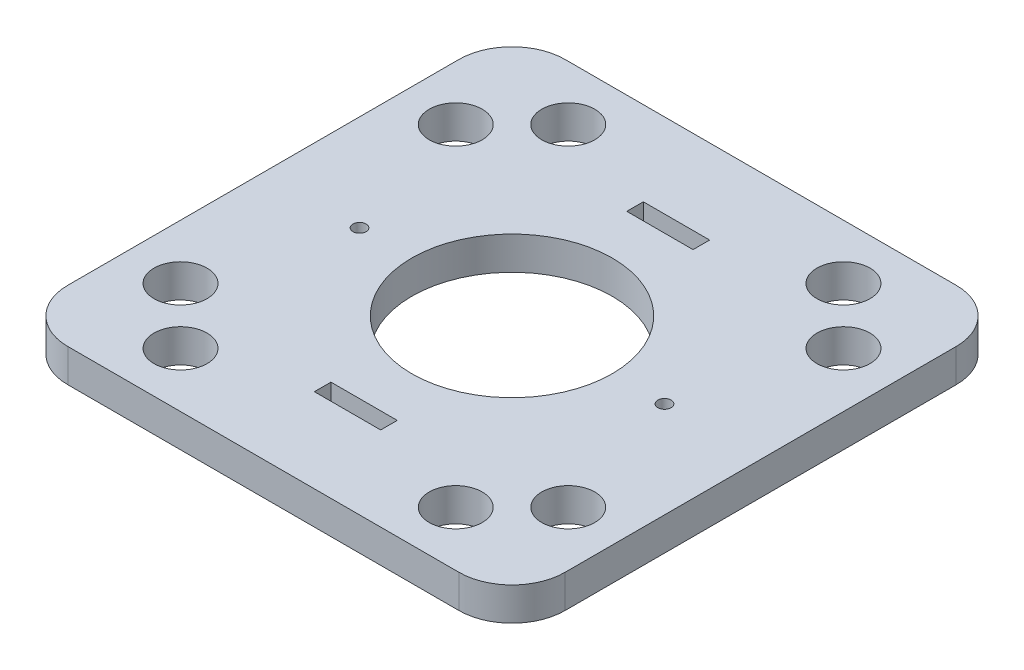
ISO-10303-21;
HEADER;
FILE_DESCRIPTION(('STEP AP214'),'2;1');
FILE_NAME('part.step','',(''),(''),'','','');
FILE_SCHEMA(('AUTOMOTIVE_DESIGN { 1 0 10303 214 1 1 1 1 }'));
ENDSEC;
DATA;
#1=APPLICATION_CONTEXT('core data for automotive mechanical design processes');
#2=APPLICATION_PROTOCOL_DEFINITION('international standard','automotive_design',2000,#1);
#3=PRODUCT_CONTEXT('',#1,'mechanical');
#4=PRODUCT('Part','Part','',(#3));
#5=PRODUCT_RELATED_PRODUCT_CATEGORY('part','',(#4));
#6=PRODUCT_DEFINITION_FORMATION('','',#4);
#7=PRODUCT_DEFINITION_CONTEXT('part definition',#1,'design');
#8=PRODUCT_DEFINITION('design','',#6,#7);
#9=PRODUCT_DEFINITION_SHAPE('','',#8);
#10=(LENGTH_UNIT() NAMED_UNIT(*) SI_UNIT(.MILLI.,.METRE.));
#11=(NAMED_UNIT(*) PLANE_ANGLE_UNIT() SI_UNIT($,.RADIAN.));
#12=(NAMED_UNIT(*) SI_UNIT($,.STERADIAN.) SOLID_ANGLE_UNIT());
#13=UNCERTAINTY_MEASURE_WITH_UNIT(LENGTH_MEASURE(1.E-05),#10,'distance_accuracy_value','');
#14=(GEOMETRIC_REPRESENTATION_CONTEXT(3) GLOBAL_UNCERTAINTY_ASSIGNED_CONTEXT((#13)) GLOBAL_UNIT_ASSIGNED_CONTEXT((#10,
#11,#12)) REPRESENTATION_CONTEXT('',''));
#15=CARTESIAN_POINT('',(0.,0.,0.));
#16=DIRECTION('',(0.,0.,1.));
#17=DIRECTION('',(1.,0.,0.));
#18=AXIS2_PLACEMENT_3D('',#15,#16,#17);
#19=CARTESIAN_POINT('',(0.,5.,0.));
#20=DIRECTION('',(0.,-1.,0.));
#21=DIRECTION('',(0.,0.,-1.));
#22=AXIS2_PLACEMENT_3D('',#19,#20,#21);
#23=PLANE('',#22);
#24=DIRECTION('',(0.,0.,-1.));
#25=VECTOR('',#24,1.);
#26=CARTESIAN_POINT('',(5.,5.,-24.8099608709656));
#27=LINE('',#26,#25);
#28=CARTESIAN_POINT('',(5.,5.,-22.3099608709656));
#29=VERTEX_POINT('',#28);
#30=CARTESIAN_POINT('',(5.,5.,-24.8099608709656));
#31=VERTEX_POINT('',#30);
#32=EDGE_CURVE('E193',#29,#31,#27,.T.);
#33=ORIENTED_EDGE('',*,*,#32,.F.);
#34=DIRECTION('',(1.,0.,0.));
#35=VECTOR('',#34,1.);
#36=CARTESIAN_POINT('',(-5.,5.,-22.3099608709656));
#37=LINE('',#36,#35);
#38=CARTESIAN_POINT('',(-5.,5.,-22.3099608709656));
#39=VERTEX_POINT('',#38);
#40=EDGE_CURVE('E201',#39,#29,#37,.T.);
#41=ORIENTED_EDGE('',*,*,#40,.F.);
#42=DIRECTION('',(0.,0.,1.));
#43=VECTOR('',#42,1.);
#44=CARTESIAN_POINT('',(-5.,5.,-24.8099608709656));
#45=LINE('',#44,#43);
#46=CARTESIAN_POINT('',(-5.,5.,-24.8099608709656));
#47=VERTEX_POINT('',#46);
#48=EDGE_CURVE('E198',#47,#39,#45,.T.);
#49=ORIENTED_EDGE('',*,*,#48,.F.);
#50=DIRECTION('',(-1.,0.,0.));
#51=VECTOR('',#50,1.);
#52=CARTESIAN_POINT('',(-5.,5.,-24.8099608709656));
#53=LINE('',#52,#51);
#54=EDGE_CURVE('E195',#31,#47,#53,.T.);
#55=ORIENTED_EDGE('',*,*,#54,.F.);
#56=EDGE_LOOP('',(#33,#41,#49,#55));
#57=FACE_BOUND('',#56,.T.);
#58=DIRECTION('',(0.,0.,1.));
#59=VECTOR('',#58,1.);
#60=CARTESIAN_POINT('',(-37.5,5.,37.5));
#61=LINE('',#60,#59);
#62=CARTESIAN_POINT('',(-37.5,5.,-29.5));
#63=VERTEX_POINT('',#62);
#64=CARTESIAN_POINT('',(-37.5,5.,29.5));
#65=VERTEX_POINT('',#64);
#66=EDGE_CURVE('E253',#63,#65,#61,.T.);
#67=ORIENTED_EDGE('',*,*,#66,.T.);
#68=CARTESIAN_POINT('',(-29.5,5.,29.5));
#69=DIRECTION('',(0.,-1.,0.));
#70=DIRECTION('',(0.,0.,-1.));
#71=AXIS2_PLACEMENT_3D('',#68,#69,#70);
#72=CIRCLE('',#71,8.);
#73=CARTESIAN_POINT('',(-29.5,5.,37.5));
#74=VERTEX_POINT('',#73);
#75=EDGE_CURVE('E291',#65,#74,#72,.F.);
#76=ORIENTED_EDGE('',*,*,#75,.T.);
#77=DIRECTION('',(1.,0.,0.));
#78=VECTOR('',#77,1.);
#79=CARTESIAN_POINT('',(-37.5,5.,37.5));
#80=LINE('',#79,#78);
#81=CARTESIAN_POINT('',(29.5,5.,37.5));
#82=VERTEX_POINT('',#81);
#83=EDGE_CURVE('E256',#74,#82,#80,.T.);
#84=ORIENTED_EDGE('',*,*,#83,.T.);
#85=CARTESIAN_POINT('',(29.5,5.,29.5));
#86=DIRECTION('',(0.,-1.,0.));
#87=DIRECTION('',(0.,0.,-1.));
#88=AXIS2_PLACEMENT_3D('',#85,#86,#87);
#89=CIRCLE('',#88,8.);
#90=CARTESIAN_POINT('',(37.5,5.,29.5));
#91=VERTEX_POINT('',#90);
#92=EDGE_CURVE('E287',#82,#91,#89,.F.);
#93=ORIENTED_EDGE('',*,*,#92,.T.);
#94=DIRECTION('',(0.,0.,-1.));
#95=VECTOR('',#94,1.);
#96=CARTESIAN_POINT('',(37.5,5.,37.5));
#97=LINE('',#96,#95);
#98=CARTESIAN_POINT('',(37.5,5.,-29.5));
#99=VERTEX_POINT('',#98);
#100=EDGE_CURVE('E248',#91,#99,#97,.T.);
#101=ORIENTED_EDGE('',*,*,#100,.T.);
#102=CARTESIAN_POINT('',(29.5,5.,-29.5));
#103=DIRECTION('',(0.,-1.,0.));
#104=DIRECTION('',(0.,0.,-1.));
#105=AXIS2_PLACEMENT_3D('',#102,#103,#104);
#106=CIRCLE('',#105,8.);
#107=CARTESIAN_POINT('',(29.5,5.,-37.5));
#108=VERTEX_POINT('',#107);
#109=EDGE_CURVE('E55',#99,#108,#106,.F.);
#110=ORIENTED_EDGE('',*,*,#109,.T.);
#111=DIRECTION('',(-1.,0.,0.));
#112=VECTOR('',#111,1.);
#113=CARTESIAN_POINT('',(-37.5,5.,-37.5));
#114=LINE('',#113,#112);
#115=CARTESIAN_POINT('',(-29.5,5.,-37.5));
#116=VERTEX_POINT('',#115);
#117=EDGE_CURVE('E250',#108,#116,#114,.T.);
#118=ORIENTED_EDGE('',*,*,#117,.T.);
#119=CARTESIAN_POINT('',(-29.5,5.,-29.5));
#120=DIRECTION('',(0.,-1.,0.));
#121=DIRECTION('',(0.,0.,-1.));
#122=AXIS2_PLACEMENT_3D('',#119,#120,#121);
#123=CIRCLE('',#122,8.);
#124=EDGE_CURVE('E289',#116,#63,#123,.F.);
#125=ORIENTED_EDGE('',*,*,#124,.T.);
#126=EDGE_LOOP('',(#67,#76,#84,#93,#101,#110,#118,#125));
#127=FACE_BOUND('',#126,.T.);
#128=CARTESIAN_POINT('',(0.,5.,0.));
#129=DIRECTION('',(0.,1.,0.));
#130=DIRECTION('',(0.,0.,1.));
#131=AXIS2_PLACEMENT_3D('',#128,#129,#130);
#132=CIRCLE('',#131,15.1197225230173);
#133=CARTESIAN_POINT('',(0.,5.,15.1197225230173));
#134=VERTEX_POINT('',#133);
#135=EDGE_CURVE('E242',#134,#134,#132,.T.);
#136=ORIENTED_EDGE('',*,*,#135,.F.);
#137=EDGE_LOOP('',(#136));
#138=FACE_BOUND('',#137,.T.);
#139=CARTESIAN_POINT('',(29.2426406871193,5.,-20.7573593128807));
#140=DIRECTION('',(0.,1.,0.));
#141=DIRECTION('',(0.,0.,1.));
#142=AXIS2_PLACEMENT_3D('',#139,#140,#141);
#143=CIRCLE('',#142,4.);
#144=CARTESIAN_POINT('',(29.2426406871193,5.,-16.7573593128807));
#145=VERTEX_POINT('',#144);
#146=EDGE_CURVE('E236',#145,#145,#143,.T.);
#147=ORIENTED_EDGE('',*,*,#146,.F.);
#148=EDGE_LOOP('',(#147));
#149=FACE_BOUND('',#148,.T.);
#150=CARTESIAN_POINT('',(-23.,5.,0.));
#151=DIRECTION('',(0.,1.,0.));
#152=DIRECTION('',(0.,0.,1.));
#153=AXIS2_PLACEMENT_3D('',#150,#151,#152);
#154=CIRCLE('',#153,1.);
#155=CARTESIAN_POINT('',(-23.,5.,1.));
#156=VERTEX_POINT('',#155);
#157=EDGE_CURVE('E230',#156,#156,#154,.T.);
#158=ORIENTED_EDGE('',*,*,#157,.F.);
#159=EDGE_LOOP('',(#158));
#160=FACE_BOUND('',#159,.T.);
#161=CARTESIAN_POINT('',(23.,5.,0.));
#162=DIRECTION('',(0.,1.,0.));
#163=DIRECTION('',(0.,0.,-1.));
#164=AXIS2_PLACEMENT_3D('',#161,#162,#163);
#165=CIRCLE('',#164,1.);
#166=CARTESIAN_POINT('',(23.,5.,-1.));
#167=VERTEX_POINT('',#166);
#168=EDGE_CURVE('E224',#167,#167,#165,.T.);
#169=ORIENTED_EDGE('',*,*,#168,.F.);
#170=EDGE_LOOP('',(#169));
#171=FACE_BOUND('',#170,.T.);
#172=DIRECTION('',(1.,0.,0.));
#173=VECTOR('',#172,1.);
#174=CARTESIAN_POINT('',(-5.00000000000001,5.,24.8099608709656));
#175=LINE('',#174,#173);
#176=CARTESIAN_POINT('',(-5.00000000000001,5.,24.8099608709656));
#177=VERTEX_POINT('',#176);
#178=CARTESIAN_POINT('',(4.99999999999999,5.,24.8099608709656));
#179=VERTEX_POINT('',#178);
#180=EDGE_CURVE('E149',#177,#179,#175,.T.);
#181=ORIENTED_EDGE('',*,*,#180,.F.);
#182=DIRECTION('',(0.,0.,1.));
#183=VECTOR('',#182,1.);
#184=CARTESIAN_POINT('',(-5.00000000000001,5.,24.8099608709656));
#185=LINE('',#184,#183);
#186=CARTESIAN_POINT('',(-5.00000000000001,5.,22.3099608709656));
#187=VERTEX_POINT('',#186);
#188=EDGE_CURVE('E175',#187,#177,#185,.T.);
#189=ORIENTED_EDGE('',*,*,#188,.F.);
#190=DIRECTION('',(-1.,0.,0.));
#191=VECTOR('',#190,1.);
#192=CARTESIAN_POINT('',(-5.00000000000001,5.,22.3099608709656));
#193=LINE('',#192,#191);
#194=CARTESIAN_POINT('',(4.99999999999999,5.,22.3099608709656));
#195=VERTEX_POINT('',#194);
#196=EDGE_CURVE('E173',#195,#187,#193,.T.);
#197=ORIENTED_EDGE('',*,*,#196,.F.);
#198=DIRECTION('',(0.,0.,-1.));
#199=VECTOR('',#198,1.);
#200=CARTESIAN_POINT('',(4.99999999999999,5.,24.8099608709656));
#201=LINE('',#200,#199);
#202=EDGE_CURVE('E159',#179,#195,#201,.T.);
#203=ORIENTED_EDGE('',*,*,#202,.F.);
#204=EDGE_LOOP('',(#181,#189,#197,#203));
#205=FACE_BOUND('',#204,.T.);
#206=CARTESIAN_POINT('',(20.7573593128807,5.,-29.2426406871193));
#207=DIRECTION('',(0.,1.,0.));
#208=DIRECTION('',(0.,0.,-1.));
#209=AXIS2_PLACEMENT_3D('',#206,#207,#208);
#210=CIRCLE('',#209,4.00000000000003);
#211=CARTESIAN_POINT('',(20.7573593128807,5.,-33.2426406871193));
#212=VERTEX_POINT('',#211);
#213=EDGE_CURVE('E182',#212,#212,#210,.T.);
#214=ORIENTED_EDGE('',*,*,#213,.F.);
#215=EDGE_LOOP('',(#214));
#216=FACE_BOUND('',#215,.T.);
#217=CARTESIAN_POINT('',(-20.7573593128807,5.,29.2426406871193));
#218=DIRECTION('',(0.,1.,0.));
#219=DIRECTION('',(0.,0.,-1.));
#220=AXIS2_PLACEMENT_3D('',#217,#218,#219);
#221=CIRCLE('',#220,4.);
#222=CARTESIAN_POINT('',(-20.7573593128807,5.,25.2426406871193));
#223=VERTEX_POINT('',#222);
#224=EDGE_CURVE('E492',#223,#223,#221,.T.);
#225=ORIENTED_EDGE('',*,*,#224,.F.);
#226=EDGE_LOOP('',(#225));
#227=FACE_BOUND('',#226,.T.);
#228=CARTESIAN_POINT('',(-29.2426406871193,5.,20.7573593128807));
#229=DIRECTION('',(0.,1.,0.));
#230=DIRECTION('',(0.,0.,1.));
#231=AXIS2_PLACEMENT_3D('',#228,#229,#230);
#232=CIRCLE('',#231,4.00000000000003);
#233=CARTESIAN_POINT('',(-29.2426406871193,5.,24.7573593128807));
#234=VERTEX_POINT('',#233);
#235=EDGE_CURVE('E487',#234,#234,#232,.T.);
#236=ORIENTED_EDGE('',*,*,#235,.F.);
#237=EDGE_LOOP('',(#236));
#238=FACE_BOUND('',#237,.T.);
#239=CARTESIAN_POINT('',(-20.7573593128807,5.,-29.2426406871193));
#240=DIRECTION('',(0.,1.,0.));
#241=DIRECTION('',(0.,0.,1.));
#242=AXIS2_PLACEMENT_3D('',#239,#240,#241);
#243=CIRCLE('',#242,3.99999999999999);
#244=CARTESIAN_POINT('',(-20.7573593128807,5.,-25.2426406871193));
#245=VERTEX_POINT('',#244);
#246=EDGE_CURVE('E482',#245,#245,#243,.T.);
#247=ORIENTED_EDGE('',*,*,#246,.F.);
#248=EDGE_LOOP('',(#247));
#249=FACE_BOUND('',#248,.T.);
#250=CARTESIAN_POINT('',(-29.2426406871193,5.,-20.7573593128807));
#251=DIRECTION('',(0.,1.,0.));
#252=DIRECTION('',(0.,0.,-1.));
#253=AXIS2_PLACEMENT_3D('',#250,#251,#252);
#254=CIRCLE('',#253,4.00000000000003);
#255=CARTESIAN_POINT('',(-29.2426406871193,5.,-24.7573593128807));
#256=VERTEX_POINT('',#255);
#257=EDGE_CURVE('E477',#256,#256,#254,.T.);
#258=ORIENTED_EDGE('',*,*,#257,.F.);
#259=EDGE_LOOP('',(#258));
#260=FACE_BOUND('',#259,.T.);
#261=CARTESIAN_POINT('',(29.2426406871193,5.,20.7573593128807));
#262=DIRECTION('',(0.,1.,0.));
#263=DIRECTION('',(0.,0.,-1.));
#264=AXIS2_PLACEMENT_3D('',#261,#262,#263);
#265=CIRCLE('',#264,4.);
#266=CARTESIAN_POINT('',(29.2426406871193,5.,16.7573593128807));
#267=VERTEX_POINT('',#266);
#268=EDGE_CURVE('E472',#267,#267,#265,.T.);
#269=ORIENTED_EDGE('',*,*,#268,.F.);
#270=EDGE_LOOP('',(#269));
#271=FACE_BOUND('',#270,.T.);
#272=CARTESIAN_POINT('',(20.7573593128807,5.,29.2426406871193));
#273=DIRECTION('',(0.,1.,0.));
#274=DIRECTION('',(0.,0.,1.));
#275=AXIS2_PLACEMENT_3D('',#272,#273,#274);
#276=CIRCLE('',#275,4.00000000000003);
#277=CARTESIAN_POINT('',(20.7573593128807,5.,33.2426406871193));
#278=VERTEX_POINT('',#277);
#279=EDGE_CURVE('E467',#278,#278,#276,.T.);
#280=ORIENTED_EDGE('',*,*,#279,.F.);
#281=EDGE_LOOP('',(#280));
#282=FACE_BOUND('',#281,.T.);
#283=ADVANCED_FACE('F33',(#57,#127,#138,#149,#160,#171,#205,#216,#227,#238,#249,#260,#271,#282),
#23,.F.);
#284=CARTESIAN_POINT('',(0.,0.,0.));
#285=DIRECTION('',(0.,-1.,0.));
#286=DIRECTION('',(0.,0.,-1.));
#287=AXIS2_PLACEMENT_3D('',#284,#285,#286);
#288=PLANE('',#287);
#289=CARTESIAN_POINT('',(29.2426406871193,0.,20.7573593128807));
#290=DIRECTION('',(0.,1.,0.));
#291=DIRECTION('',(0.,0.,-1.));
#292=AXIS2_PLACEMENT_3D('',#289,#290,#291);
#293=CIRCLE('',#292,4.);
#294=CARTESIAN_POINT('',(29.2426406871193,0.,16.7573593128807));
#295=VERTEX_POINT('',#294);
#296=EDGE_CURVE('E469',#295,#295,#293,.T.);
#297=ORIENTED_EDGE('',*,*,#296,.T.);
#298=EDGE_LOOP('',(#297));
#299=FACE_BOUND('',#298,.T.);
#300=CARTESIAN_POINT('',(-20.7573593128807,0.,-29.2426406871193));
#301=DIRECTION('',(0.,1.,0.));
#302=DIRECTION('',(0.,0.,1.));
#303=AXIS2_PLACEMENT_3D('',#300,#301,#302);
#304=CIRCLE('',#303,3.99999999999999);
#305=CARTESIAN_POINT('',(-20.7573593128807,0.,-25.2426406871193));
#306=VERTEX_POINT('',#305);
#307=EDGE_CURVE('E480',#306,#306,#304,.T.);
#308=ORIENTED_EDGE('',*,*,#307,.T.);
#309=EDGE_LOOP('',(#308));
#310=FACE_BOUND('',#309,.T.);
#311=CARTESIAN_POINT('',(-20.7573593128807,0.,29.2426406871193));
#312=DIRECTION('',(0.,1.,0.));
#313=DIRECTION('',(0.,0.,-1.));
#314=AXIS2_PLACEMENT_3D('',#311,#312,#313);
#315=CIRCLE('',#314,4.);
#316=CARTESIAN_POINT('',(-20.7573593128807,0.,25.2426406871193));
#317=VERTEX_POINT('',#316);
#318=EDGE_CURVE('E490',#317,#317,#315,.T.);
#319=ORIENTED_EDGE('',*,*,#318,.T.);
#320=EDGE_LOOP('',(#319));
#321=FACE_BOUND('',#320,.T.);
#322=DIRECTION('',(0.,0.,1.));
#323=VECTOR('',#322,1.);
#324=CARTESIAN_POINT('',(-5.00000000000001,0.,24.8099608709656));
#325=LINE('',#324,#323);
#326=CARTESIAN_POINT('',(-5.00000000000001,0.,22.3099608709656));
#327=VERTEX_POINT('',#326);
#328=CARTESIAN_POINT('',(-5.00000000000001,0.,24.8099608709656));
#329=VERTEX_POINT('',#328);
#330=EDGE_CURVE('E160',#327,#329,#325,.T.);
#331=ORIENTED_EDGE('',*,*,#330,.T.);
#332=DIRECTION('',(1.,0.,0.));
#333=VECTOR('',#332,1.);
#334=CARTESIAN_POINT('',(-5.00000000000001,0.,24.8099608709656));
#335=LINE('',#334,#333);
#336=CARTESIAN_POINT('',(4.99999999999999,0.,24.8099608709656));
#337=VERTEX_POINT('',#336);
#338=EDGE_CURVE('E180',#329,#337,#335,.T.);
#339=ORIENTED_EDGE('',*,*,#338,.T.);
#340=DIRECTION('',(0.,0.,-1.));
#341=VECTOR('',#340,1.);
#342=CARTESIAN_POINT('',(4.99999999999999,0.,24.8099608709656));
#343=LINE('',#342,#341);
#344=CARTESIAN_POINT('',(4.99999999999999,0.,22.3099608709656));
#345=VERTEX_POINT('',#344);
#346=EDGE_CURVE('E166',#337,#345,#343,.T.);
#347=ORIENTED_EDGE('',*,*,#346,.T.);
#348=DIRECTION('',(-1.,0.,0.));
#349=VECTOR('',#348,1.);
#350=CARTESIAN_POINT('',(-5.00000000000001,0.,22.3099608709656));
#351=LINE('',#350,#349);
#352=EDGE_CURVE('E184',#345,#327,#351,.T.);
#353=ORIENTED_EDGE('',*,*,#352,.T.);
#354=EDGE_LOOP('',(#331,#339,#347,#353));
#355=FACE_BOUND('',#354,.T.);
#356=DIRECTION('',(1.,0.,0.));
#357=VECTOR('',#356,1.);
#358=CARTESIAN_POINT('',(-5.,0.,-22.3099608709656));
#359=LINE('',#358,#357);
#360=CARTESIAN_POINT('',(-5.,0.,-22.3099608709656));
#361=VERTEX_POINT('',#360);
#362=CARTESIAN_POINT('',(5.,0.,-22.3099608709656));
#363=VERTEX_POINT('',#362);
#364=EDGE_CURVE('E196',#361,#363,#359,.T.);
#365=ORIENTED_EDGE('',*,*,#364,.T.);
#366=DIRECTION('',(0.,0.,-1.));
#367=VECTOR('',#366,1.);
#368=CARTESIAN_POINT('',(5.,0.,-24.8099608709656));
#369=LINE('',#368,#367);
#370=CARTESIAN_POINT('',(5.,0.,-24.8099608709656));
#371=VERTEX_POINT('',#370);
#372=EDGE_CURVE('E167',#363,#371,#369,.T.);
#373=ORIENTED_EDGE('',*,*,#372,.T.);
#374=DIRECTION('',(-1.,0.,0.));
#375=VECTOR('',#374,1.);
#376=CARTESIAN_POINT('',(-5.,0.,-24.8099608709656));
#377=LINE('',#376,#375);
#378=CARTESIAN_POINT('',(-5.,0.,-24.8099608709656));
#379=VERTEX_POINT('',#378);
#380=EDGE_CURVE('E206',#371,#379,#377,.T.);
#381=ORIENTED_EDGE('',*,*,#380,.T.);
#382=DIRECTION('',(0.,0.,1.));
#383=VECTOR('',#382,1.);
#384=CARTESIAN_POINT('',(-5.,0.,-24.8099608709656));
#385=LINE('',#384,#383);
#386=EDGE_CURVE('E209',#379,#361,#385,.T.);
#387=ORIENTED_EDGE('',*,*,#386,.T.);
#388=EDGE_LOOP('',(#365,#373,#381,#387));
#389=FACE_BOUND('',#388,.T.);
#390=CARTESIAN_POINT('',(23.,0.,0.));
#391=DIRECTION('',(0.,1.,0.));
#392=DIRECTION('',(0.,0.,-1.));
#393=AXIS2_PLACEMENT_3D('',#390,#391,#392);
#394=CIRCLE('',#393,1.);
#395=CARTESIAN_POINT('',(23.,0.,-1.));
#396=VERTEX_POINT('',#395);
#397=EDGE_CURVE('E223',#396,#396,#394,.T.);
#398=ORIENTED_EDGE('',*,*,#397,.T.);
#399=EDGE_LOOP('',(#398));
#400=FACE_BOUND('',#399,.T.);
#401=CARTESIAN_POINT('',(29.2426406871193,0.,-20.7573593128807));
#402=DIRECTION('',(0.,1.,0.));
#403=DIRECTION('',(0.,0.,1.));
#404=AXIS2_PLACEMENT_3D('',#401,#402,#403);
#405=CIRCLE('',#404,4.);
#406=CARTESIAN_POINT('',(29.2426406871193,0.,-16.7573593128807));
#407=VERTEX_POINT('',#406);
#408=EDGE_CURVE('E233',#407,#407,#405,.T.);
#409=ORIENTED_EDGE('',*,*,#408,.T.);
#410=EDGE_LOOP('',(#409));
#411=FACE_BOUND('',#410,.T.);
#412=DIRECTION('',(1.,0.,0.));
#413=VECTOR('',#412,1.);
#414=CARTESIAN_POINT('',(-37.5,0.,37.5));
#415=LINE('',#414,#413);
#416=CARTESIAN_POINT('',(-29.5,0.,37.5));
#417=VERTEX_POINT('',#416);
#418=CARTESIAN_POINT('',(29.5,0.,37.5));
#419=VERTEX_POINT('',#418);
#420=EDGE_CURVE('E251',#417,#419,#415,.T.);
#421=ORIENTED_EDGE('',*,*,#420,.F.);
#422=CARTESIAN_POINT('',(-29.5,0.,29.5));
#423=DIRECTION('',(0.,-1.,0.));
#424=DIRECTION('',(0.,0.,-1.));
#425=AXIS2_PLACEMENT_3D('',#422,#423,#424);
#426=CIRCLE('',#425,8.);
#427=CARTESIAN_POINT('',(-37.5,0.,29.5));
#428=VERTEX_POINT('',#427);
#429=EDGE_CURVE('E279',#417,#428,#426,.T.);
#430=ORIENTED_EDGE('',*,*,#429,.T.);
#431=DIRECTION('',(0.,0.,1.));
#432=VECTOR('',#431,1.);
#433=CARTESIAN_POINT('',(-37.5,0.,37.5));
#434=LINE('',#433,#432);
#435=CARTESIAN_POINT('',(-37.5,0.,-29.5));
#436=VERTEX_POINT('',#435);
#437=EDGE_CURVE('E264',#436,#428,#434,.T.);
#438=ORIENTED_EDGE('',*,*,#437,.F.);
#439=CARTESIAN_POINT('',(-29.5,0.,-29.5));
#440=DIRECTION('',(0.,-1.,0.));
#441=DIRECTION('',(0.,0.,-1.));
#442=AXIS2_PLACEMENT_3D('',#439,#440,#441);
#443=CIRCLE('',#442,8.);
#444=CARTESIAN_POINT('',(-29.5,0.,-37.5));
#445=VERTEX_POINT('',#444);
#446=EDGE_CURVE('E277',#436,#445,#443,.T.);
#447=ORIENTED_EDGE('',*,*,#446,.T.);
#448=DIRECTION('',(-1.,0.,0.));
#449=VECTOR('',#448,1.);
#450=CARTESIAN_POINT('',(-37.5,0.,-37.5));
#451=LINE('',#450,#449);
#452=CARTESIAN_POINT('',(29.5,0.,-37.5));
#453=VERTEX_POINT('',#452);
#454=EDGE_CURVE('E262',#453,#445,#451,.T.);
#455=ORIENTED_EDGE('',*,*,#454,.F.);
#456=CARTESIAN_POINT('',(29.5,0.,-29.5));
#457=DIRECTION('',(0.,-1.,0.));
#458=DIRECTION('',(0.,0.,-1.));
#459=AXIS2_PLACEMENT_3D('',#456,#457,#458);
#460=CIRCLE('',#459,8.);
#461=CARTESIAN_POINT('',(37.5,0.,-29.5));
#462=VERTEX_POINT('',#461);
#463=EDGE_CURVE('E273',#453,#462,#460,.T.);
#464=ORIENTED_EDGE('',*,*,#463,.T.);
#465=DIRECTION('',(0.,0.,-1.));
#466=VECTOR('',#465,1.);
#467=CARTESIAN_POINT('',(37.5,0.,37.5));
#468=LINE('',#467,#466);
#469=CARTESIAN_POINT('',(37.5,0.,29.5));
#470=VERTEX_POINT('',#469);
#471=EDGE_CURVE('E245',#470,#462,#468,.T.);
#472=ORIENTED_EDGE('',*,*,#471,.F.);
#473=CARTESIAN_POINT('',(29.5,0.,29.5));
#474=DIRECTION('',(0.,-1.,0.));
#475=DIRECTION('',(0.,0.,-1.));
#476=AXIS2_PLACEMENT_3D('',#473,#474,#475);
#477=CIRCLE('',#476,8.);
#478=EDGE_CURVE('E275',#470,#419,#477,.T.);
#479=ORIENTED_EDGE('',*,*,#478,.T.);
#480=EDGE_LOOP('',(#421,#430,#438,#447,#455,#464,#472,#479));
#481=FACE_BOUND('',#480,.T.);
#482=CARTESIAN_POINT('',(0.,0.,0.));
#483=DIRECTION('',(0.,1.,0.));
#484=DIRECTION('',(0.,0.,1.));
#485=AXIS2_PLACEMENT_3D('',#482,#483,#484);
#486=CIRCLE('',#485,15.1197225230173);
#487=CARTESIAN_POINT('',(0.,0.,15.1197225230173));
#488=VERTEX_POINT('',#487);
#489=EDGE_CURVE('E239',#488,#488,#486,.T.);
#490=ORIENTED_EDGE('',*,*,#489,.T.);
#491=EDGE_LOOP('',(#490));
#492=FACE_BOUND('',#491,.T.);
#493=CARTESIAN_POINT('',(-23.,0.,0.));
#494=DIRECTION('',(0.,1.,0.));
#495=DIRECTION('',(0.,0.,1.));
#496=AXIS2_PLACEMENT_3D('',#493,#494,#495);
#497=CIRCLE('',#496,1.);
#498=CARTESIAN_POINT('',(-23.,0.,1.));
#499=VERTEX_POINT('',#498);
#500=EDGE_CURVE('E227',#499,#499,#497,.T.);
#501=ORIENTED_EDGE('',*,*,#500,.T.);
#502=EDGE_LOOP('',(#501));
#503=FACE_BOUND('',#502,.T.);
#504=CARTESIAN_POINT('',(20.7573593128807,0.,-29.2426406871193));
#505=DIRECTION('',(0.,1.,0.));
#506=DIRECTION('',(0.,0.,-1.));
#507=AXIS2_PLACEMENT_3D('',#504,#505,#506);
#508=CIRCLE('',#507,4.00000000000003);
#509=CARTESIAN_POINT('',(20.7573593128807,0.,-33.2426406871193));
#510=VERTEX_POINT('',#509);
#511=EDGE_CURVE('E455',#510,#510,#508,.T.);
#512=ORIENTED_EDGE('',*,*,#511,.T.);
#513=EDGE_LOOP('',(#512));
#514=FACE_BOUND('',#513,.T.);
#515=CARTESIAN_POINT('',(-29.2426406871193,0.,20.7573593128807));
#516=DIRECTION('',(0.,1.,0.));
#517=DIRECTION('',(0.,0.,1.));
#518=AXIS2_PLACEMENT_3D('',#515,#516,#517);
#519=CIRCLE('',#518,4.00000000000003);
#520=CARTESIAN_POINT('',(-29.2426406871193,0.,24.7573593128807));
#521=VERTEX_POINT('',#520);
#522=EDGE_CURVE('E459',#521,#521,#519,.T.);
#523=ORIENTED_EDGE('',*,*,#522,.T.);
#524=EDGE_LOOP('',(#523));
#525=FACE_BOUND('',#524,.T.);
#526=CARTESIAN_POINT('',(-29.2426406871193,0.,-20.7573593128807));
#527=DIRECTION('',(0.,1.,0.));
#528=DIRECTION('',(0.,0.,-1.));
#529=AXIS2_PLACEMENT_3D('',#526,#527,#528);
#530=CIRCLE('',#529,4.00000000000003);
#531=CARTESIAN_POINT('',(-29.2426406871193,0.,-24.7573593128807));
#532=VERTEX_POINT('',#531);
#533=EDGE_CURVE('E463',#532,#532,#530,.T.);
#534=ORIENTED_EDGE('',*,*,#533,.T.);
#535=EDGE_LOOP('',(#534));
#536=FACE_BOUND('',#535,.T.);
#537=CARTESIAN_POINT('',(20.7573593128807,0.,29.2426406871193));
#538=DIRECTION('',(0.,1.,0.));
#539=DIRECTION('',(0.,0.,1.));
#540=AXIS2_PLACEMENT_3D('',#537,#538,#539);
#541=CIRCLE('',#540,4.00000000000003);
#542=CARTESIAN_POINT('',(20.7573593128807,0.,33.2426406871193));
#543=VERTEX_POINT('',#542);
#544=EDGE_CURVE('E466',#543,#543,#541,.T.);
#545=ORIENTED_EDGE('',*,*,#544,.T.);
#546=EDGE_LOOP('',(#545));
#547=FACE_BOUND('',#546,.T.);
#548=ADVANCED_FACE('F310',(#299,#310,#321,#355,#389,#400,#411,#481,#492,#503,#514,#525,#536,
#547),#288,.T.);
#549=CARTESIAN_POINT('',(37.5,5.,37.5));
#550=DIRECTION('',(-1.,0.,0.));
#551=DIRECTION('',(0.,0.,1.));
#552=AXIS2_PLACEMENT_3D('',#549,#550,#551);
#553=PLANE('',#552);
#554=ORIENTED_EDGE('',*,*,#100,.F.);
#555=DIRECTION('',(0.,-1.,0.));
#556=VECTOR('',#555,1.);
#557=CARTESIAN_POINT('',(37.5,5.,29.5));
#558=LINE('',#557,#556);
#559=EDGE_CURVE('E11',#91,#470,#558,.T.);
#560=ORIENTED_EDGE('',*,*,#559,.T.);
#561=ORIENTED_EDGE('',*,*,#471,.T.);
#562=DIRECTION('',(0.,-1.,0.));
#563=VECTOR('',#562,1.);
#564=CARTESIAN_POINT('',(37.5,5.,-29.5));
#565=LINE('',#564,#563);
#566=EDGE_CURVE('E41',#462,#99,#565,.F.);
#567=ORIENTED_EDGE('',*,*,#566,.T.);
#568=EDGE_LOOP('',(#554,#560,#561,#567));
#569=FACE_BOUND('',#568,.T.);
#570=ADVANCED_FACE('F299',(#569),#553,.F.);
#571=CARTESIAN_POINT('',(-37.5,5.,-37.5));
#572=DIRECTION('',(0.,0.,1.));
#573=DIRECTION('',(1.,0.,0.));
#574=AXIS2_PLACEMENT_3D('',#571,#572,#573);
#575=PLANE('',#574);
#576=ORIENTED_EDGE('',*,*,#454,.T.);
#577=DIRECTION('',(0.,-1.,0.));
#578=VECTOR('',#577,1.);
#579=CARTESIAN_POINT('',(-29.5,5.,-37.5));
#580=LINE('',#579,#578);
#581=EDGE_CURVE('E48',#445,#116,#580,.F.);
#582=ORIENTED_EDGE('',*,*,#581,.T.);
#583=ORIENTED_EDGE('',*,*,#117,.F.);
#584=DIRECTION('',(0.,-1.,0.));
#585=VECTOR('',#584,1.);
#586=CARTESIAN_POINT('',(29.5,5.,-37.5));
#587=LINE('',#586,#585);
#588=EDGE_CURVE('E293',#108,#453,#587,.T.);
#589=ORIENTED_EDGE('',*,*,#588,.T.);
#590=EDGE_LOOP('',(#576,#582,#583,#589));
#591=FACE_BOUND('',#590,.T.);
#592=ADVANCED_FACE('F307',(#591),#575,.F.);
#593=CARTESIAN_POINT('',(-37.5,5.,37.5));
#594=DIRECTION('',(1.,0.,0.));
#595=DIRECTION('',(0.,0.,-1.));
#596=AXIS2_PLACEMENT_3D('',#593,#594,#595);
#597=PLANE('',#596);
#598=ORIENTED_EDGE('',*,*,#437,.T.);
#599=DIRECTION('',(0.,-1.,0.));
#600=VECTOR('',#599,1.);
#601=CARTESIAN_POINT('',(-37.5,5.,29.5));
#602=LINE('',#601,#600);
#603=EDGE_CURVE('E284',#428,#65,#602,.F.);
#604=ORIENTED_EDGE('',*,*,#603,.T.);
#605=ORIENTED_EDGE('',*,*,#66,.F.);
#606=DIRECTION('',(0.,-1.,0.));
#607=VECTOR('',#606,1.);
#608=CARTESIAN_POINT('',(-37.5,5.,-29.5));
#609=LINE('',#608,#607);
#610=EDGE_CURVE('E281',#63,#436,#609,.T.);
#611=ORIENTED_EDGE('',*,*,#610,.T.);
#612=EDGE_LOOP('',(#598,#604,#605,#611));
#613=FACE_BOUND('',#612,.T.);
#614=ADVANCED_FACE('F319',(#613),#597,.F.);
#615=CARTESIAN_POINT('',(-37.5,5.,37.5));
#616=DIRECTION('',(0.,0.,-1.));
#617=DIRECTION('',(-1.,0.,0.));
#618=AXIS2_PLACEMENT_3D('',#615,#616,#617);
#619=PLANE('',#618);
#620=ORIENTED_EDGE('',*,*,#83,.F.);
#621=DIRECTION('',(0.,-1.,0.));
#622=VECTOR('',#621,1.);
#623=CARTESIAN_POINT('',(-29.5,5.,37.5));
#624=LINE('',#623,#622);
#625=EDGE_CURVE('E270',#74,#417,#624,.T.);
#626=ORIENTED_EDGE('',*,*,#625,.T.);
#627=ORIENTED_EDGE('',*,*,#420,.T.);
#628=DIRECTION('',(0.,-1.,0.));
#629=VECTOR('',#628,1.);
#630=CARTESIAN_POINT('',(29.5,5.,37.5));
#631=LINE('',#630,#629);
#632=EDGE_CURVE('E259',#419,#82,#631,.F.);
#633=ORIENTED_EDGE('',*,*,#632,.T.);
#634=EDGE_LOOP('',(#620,#626,#627,#633));
#635=FACE_BOUND('',#634,.T.);
#636=ADVANCED_FACE('F327',(#635),#619,.F.);
#637=CARTESIAN_POINT('',(0.,5.,0.));
#638=DIRECTION('',(0.,-1.,0.));
#639=DIRECTION('',(0.,0.,-1.));
#640=AXIS2_PLACEMENT_3D('',#637,#638,#639);
#641=CYLINDRICAL_SURFACE('',#640,15.1197225230173);
#642=ORIENTED_EDGE('',*,*,#135,.T.);
#643=EDGE_LOOP('',(#642));
#644=FACE_BOUND('',#643,.T.);
#645=ORIENTED_EDGE('',*,*,#489,.F.);
#646=EDGE_LOOP('',(#645));
#647=FACE_BOUND('',#646,.T.);
#648=ADVANCED_FACE('F347',(#644,#647),#641,.F.);
#649=CARTESIAN_POINT('',(29.2426406871193,5.,-20.7573593128807));
#650=DIRECTION('',(0.,-1.,0.));
#651=DIRECTION('',(0.,0.,-1.));
#652=AXIS2_PLACEMENT_3D('',#649,#650,#651);
#653=CYLINDRICAL_SURFACE('',#652,4.);
#654=ORIENTED_EDGE('',*,*,#146,.T.);
#655=EDGE_LOOP('',(#654));
#656=FACE_BOUND('',#655,.T.);
#657=ORIENTED_EDGE('',*,*,#408,.F.);
#658=EDGE_LOOP('',(#657));
#659=FACE_BOUND('',#658,.T.);
#660=ADVANCED_FACE('F428',(#656,#659),#653,.F.);
#661=CARTESIAN_POINT('',(-23.,5.,0.));
#662=DIRECTION('',(0.,-1.,0.));
#663=DIRECTION('',(0.,0.,-1.));
#664=AXIS2_PLACEMENT_3D('',#661,#662,#663);
#665=CYLINDRICAL_SURFACE('',#664,1.);
#666=ORIENTED_EDGE('',*,*,#157,.T.);
#667=EDGE_LOOP('',(#666));
#668=FACE_BOUND('',#667,.T.);
#669=ORIENTED_EDGE('',*,*,#500,.F.);
#670=EDGE_LOOP('',(#669));
#671=FACE_BOUND('',#670,.T.);
#672=ADVANCED_FACE('F425',(#668,#671),#665,.F.);
#673=CARTESIAN_POINT('',(23.,5.,0.));
#674=DIRECTION('',(0.,-1.,0.));
#675=DIRECTION('',(0.,0.,-1.));
#676=AXIS2_PLACEMENT_3D('',#673,#674,#675);
#677=CYLINDRICAL_SURFACE('',#676,1.);
#678=ORIENTED_EDGE('',*,*,#168,.T.);
#679=EDGE_LOOP('',(#678));
#680=FACE_BOUND('',#679,.T.);
#681=ORIENTED_EDGE('',*,*,#397,.F.);
#682=EDGE_LOOP('',(#681));
#683=FACE_BOUND('',#682,.T.);
#684=ADVANCED_FACE('F421',(#680,#683),#677,.F.);
#685=CARTESIAN_POINT('',(5.,5.,-24.8099608709656));
#686=DIRECTION('',(-1.,0.,0.));
#687=DIRECTION('',(0.,0.,1.));
#688=AXIS2_PLACEMENT_3D('',#685,#686,#687);
#689=PLANE('',#688);
#690=ORIENTED_EDGE('',*,*,#372,.F.);
#691=DIRECTION('',(0.,-1.,0.));
#692=VECTOR('',#691,1.);
#693=CARTESIAN_POINT('',(5.,5.,-22.3099608709656));
#694=LINE('',#693,#692);
#695=EDGE_CURVE('E203',#29,#363,#694,.T.);
#696=ORIENTED_EDGE('',*,*,#695,.F.);
#697=ORIENTED_EDGE('',*,*,#32,.T.);
#698=DIRECTION('',(0.,-1.,0.));
#699=VECTOR('',#698,1.);
#700=CARTESIAN_POINT('',(5.,5.,-24.8099608709656));
#701=LINE('',#700,#699);
#702=EDGE_CURVE('E220',#31,#371,#701,.T.);
#703=ORIENTED_EDGE('',*,*,#702,.T.);
#704=EDGE_LOOP('',(#690,#696,#697,#703));
#705=FACE_BOUND('',#704,.T.);
#706=ADVANCED_FACE('F417',(#705),#689,.T.);
#707=CARTESIAN_POINT('',(-5.,5.,-24.8099608709656));
#708=DIRECTION('',(0.,0.,1.));
#709=DIRECTION('',(1.,0.,0.));
#710=AXIS2_PLACEMENT_3D('',#707,#708,#709);
#711=PLANE('',#710);
#712=ORIENTED_EDGE('',*,*,#380,.F.);
#713=ORIENTED_EDGE('',*,*,#702,.F.);
#714=ORIENTED_EDGE('',*,*,#54,.T.);
#715=DIRECTION('',(0.,-1.,0.));
#716=VECTOR('',#715,1.);
#717=CARTESIAN_POINT('',(-5.,5.,-24.8099608709656));
#718=LINE('',#717,#716);
#719=EDGE_CURVE('E218',#47,#379,#718,.T.);
#720=ORIENTED_EDGE('',*,*,#719,.T.);
#721=EDGE_LOOP('',(#712,#713,#714,#720));
#722=FACE_BOUND('',#721,.T.);
#723=ADVANCED_FACE('F413',(#722),#711,.T.);
#724=CARTESIAN_POINT('',(-5.,5.,-24.8099608709656));
#725=DIRECTION('',(1.,0.,0.));
#726=DIRECTION('',(0.,0.,-1.));
#727=AXIS2_PLACEMENT_3D('',#724,#725,#726);
#728=PLANE('',#727);
#729=ORIENTED_EDGE('',*,*,#386,.F.);
#730=ORIENTED_EDGE('',*,*,#719,.F.);
#731=ORIENTED_EDGE('',*,*,#48,.T.);
#732=DIRECTION('',(0.,-1.,0.));
#733=VECTOR('',#732,1.);
#734=CARTESIAN_POINT('',(-5.,5.,-22.3099608709656));
#735=LINE('',#734,#733);
#736=EDGE_CURVE('E216',#39,#361,#735,.T.);
#737=ORIENTED_EDGE('',*,*,#736,.T.);
#738=EDGE_LOOP('',(#729,#730,#731,#737));
#739=FACE_BOUND('',#738,.T.);
#740=ADVANCED_FACE('F409',(#739),#728,.T.);
#741=CARTESIAN_POINT('',(-5.,5.,-22.3099608709656));
#742=DIRECTION('',(0.,0.,-1.));
#743=DIRECTION('',(-1.,0.,0.));
#744=AXIS2_PLACEMENT_3D('',#741,#742,#743);
#745=PLANE('',#744);
#746=ORIENTED_EDGE('',*,*,#364,.F.);
#747=ORIENTED_EDGE('',*,*,#736,.F.);
#748=ORIENTED_EDGE('',*,*,#40,.T.);
#749=ORIENTED_EDGE('',*,*,#695,.T.);
#750=EDGE_LOOP('',(#746,#747,#748,#749));
#751=FACE_BOUND('',#750,.T.);
#752=ADVANCED_FACE('F406',(#751),#745,.T.);
#753=CARTESIAN_POINT('',(-5.00000000000001,5.,24.8099608709656));
#754=DIRECTION('',(0.,0.,-1.));
#755=DIRECTION('',(-1.,0.,0.));
#756=AXIS2_PLACEMENT_3D('',#753,#754,#755);
#757=PLANE('',#756);
#758=ORIENTED_EDGE('',*,*,#338,.F.);
#759=DIRECTION('',(0.,-1.,0.));
#760=VECTOR('',#759,1.);
#761=CARTESIAN_POINT('',(-5.00000000000001,5.,24.8099608709656));
#762=LINE('',#761,#760);
#763=EDGE_CURVE('E155',#177,#329,#762,.T.);
#764=ORIENTED_EDGE('',*,*,#763,.F.);
#765=ORIENTED_EDGE('',*,*,#180,.T.);
#766=DIRECTION('',(0.,-1.,0.));
#767=VECTOR('',#766,1.);
#768=CARTESIAN_POINT('',(4.99999999999999,5.,24.8099608709656));
#769=LINE('',#768,#767);
#770=EDGE_CURVE('E152',#179,#337,#769,.T.);
#771=ORIENTED_EDGE('',*,*,#770,.T.);
#772=EDGE_LOOP('',(#758,#764,#765,#771));
#773=FACE_BOUND('',#772,.T.);
#774=ADVANCED_FACE('F151',(#773),#757,.T.);
#775=CARTESIAN_POINT('',(4.99999999999999,5.,24.8099608709656));
#776=DIRECTION('',(-1.,0.,0.));
#777=DIRECTION('',(0.,0.,1.));
#778=AXIS2_PLACEMENT_3D('',#775,#776,#777);
#779=PLANE('',#778);
#780=ORIENTED_EDGE('',*,*,#346,.F.);
#781=ORIENTED_EDGE('',*,*,#770,.F.);
#782=ORIENTED_EDGE('',*,*,#202,.T.);
#783=DIRECTION('',(0.,-1.,0.));
#784=VECTOR('',#783,1.);
#785=CARTESIAN_POINT('',(4.99999999999999,5.,22.3099608709656));
#786=LINE('',#785,#784);
#787=EDGE_CURVE('E168',#195,#345,#786,.T.);
#788=ORIENTED_EDGE('',*,*,#787,.T.);
#789=EDGE_LOOP('',(#780,#781,#782,#788));
#790=FACE_BOUND('',#789,.T.);
#791=ADVANCED_FACE('F163',(#790),#779,.T.);
#792=CARTESIAN_POINT('',(-5.00000000000001,5.,22.3099608709656));
#793=DIRECTION('',(0.,0.,1.));
#794=DIRECTION('',(1.,0.,0.));
#795=AXIS2_PLACEMENT_3D('',#792,#793,#794);
#796=PLANE('',#795);
#797=ORIENTED_EDGE('',*,*,#352,.F.);
#798=ORIENTED_EDGE('',*,*,#787,.F.);
#799=ORIENTED_EDGE('',*,*,#196,.T.);
#800=DIRECTION('',(0.,-1.,0.));
#801=VECTOR('',#800,1.);
#802=CARTESIAN_POINT('',(-5.00000000000001,5.,22.3099608709656));
#803=LINE('',#802,#801);
#804=EDGE_CURVE('E190',#187,#327,#803,.T.);
#805=ORIENTED_EDGE('',*,*,#804,.T.);
#806=EDGE_LOOP('',(#797,#798,#799,#805));
#807=FACE_BOUND('',#806,.T.);
#808=ADVANCED_FACE('F397',(#807),#796,.T.);
#809=CARTESIAN_POINT('',(-5.00000000000001,5.,24.8099608709656));
#810=DIRECTION('',(1.,0.,0.));
#811=DIRECTION('',(0.,0.,-1.));
#812=AXIS2_PLACEMENT_3D('',#809,#810,#811);
#813=PLANE('',#812);
#814=ORIENTED_EDGE('',*,*,#330,.F.);
#815=ORIENTED_EDGE('',*,*,#804,.F.);
#816=ORIENTED_EDGE('',*,*,#188,.T.);
#817=ORIENTED_EDGE('',*,*,#763,.T.);
#818=EDGE_LOOP('',(#814,#815,#816,#817));
#819=FACE_BOUND('',#818,.T.);
#820=ADVANCED_FACE('F393',(#819),#813,.T.);
#821=CARTESIAN_POINT('',(20.7573593128807,5.,-29.2426406871193));
#822=DIRECTION('',(0.,-1.,0.));
#823=DIRECTION('',(0.,0.,-1.));
#824=AXIS2_PLACEMENT_3D('',#821,#822,#823);
#825=CYLINDRICAL_SURFACE('',#824,4.00000000000003);
#826=ORIENTED_EDGE('',*,*,#213,.T.);
#827=EDGE_LOOP('',(#826));
#828=FACE_BOUND('',#827,.T.);
#829=ORIENTED_EDGE('',*,*,#511,.F.);
#830=EDGE_LOOP('',(#829));
#831=FACE_BOUND('',#830,.T.);
#832=ADVANCED_FACE('F389',(#828,#831),#825,.F.);
#833=CARTESIAN_POINT('',(-20.7573593128807,5.,29.2426406871193));
#834=DIRECTION('',(0.,-1.,0.));
#835=DIRECTION('',(0.,0.,-1.));
#836=AXIS2_PLACEMENT_3D('',#833,#834,#835);
#837=CYLINDRICAL_SURFACE('',#836,4.);
#838=ORIENTED_EDGE('',*,*,#224,.T.);
#839=EDGE_LOOP('',(#838));
#840=FACE_BOUND('',#839,.T.);
#841=ORIENTED_EDGE('',*,*,#318,.F.);
#842=EDGE_LOOP('',(#841));
#843=FACE_BOUND('',#842,.T.);
#844=ADVANCED_FACE('F385',(#840,#843),#837,.F.);
#845=CARTESIAN_POINT('',(-29.2426406871193,5.,20.7573593128807));
#846=DIRECTION('',(0.,-1.,0.));
#847=DIRECTION('',(0.,0.,-1.));
#848=AXIS2_PLACEMENT_3D('',#845,#846,#847);
#849=CYLINDRICAL_SURFACE('',#848,4.00000000000003);
#850=ORIENTED_EDGE('',*,*,#235,.T.);
#851=EDGE_LOOP('',(#850));
#852=FACE_BOUND('',#851,.T.);
#853=ORIENTED_EDGE('',*,*,#522,.F.);
#854=EDGE_LOOP('',(#853));
#855=FACE_BOUND('',#854,.T.);
#856=ADVANCED_FACE('F381',(#852,#855),#849,.F.);
#857=CARTESIAN_POINT('',(-20.7573593128807,5.,-29.2426406871193));
#858=DIRECTION('',(0.,-1.,0.));
#859=DIRECTION('',(0.,0.,-1.));
#860=AXIS2_PLACEMENT_3D('',#857,#858,#859);
#861=CYLINDRICAL_SURFACE('',#860,3.99999999999999);
#862=ORIENTED_EDGE('',*,*,#246,.T.);
#863=EDGE_LOOP('',(#862));
#864=FACE_BOUND('',#863,.T.);
#865=ORIENTED_EDGE('',*,*,#307,.F.);
#866=EDGE_LOOP('',(#865));
#867=FACE_BOUND('',#866,.T.);
#868=ADVANCED_FACE('F377',(#864,#867),#861,.F.);
#869=CARTESIAN_POINT('',(-29.2426406871193,5.,-20.7573593128807));
#870=DIRECTION('',(0.,-1.,0.));
#871=DIRECTION('',(0.,0.,-1.));
#872=AXIS2_PLACEMENT_3D('',#869,#870,#871);
#873=CYLINDRICAL_SURFACE('',#872,4.00000000000003);
#874=ORIENTED_EDGE('',*,*,#257,.T.);
#875=EDGE_LOOP('',(#874));
#876=FACE_BOUND('',#875,.T.);
#877=ORIENTED_EDGE('',*,*,#533,.F.);
#878=EDGE_LOOP('',(#877));
#879=FACE_BOUND('',#878,.T.);
#880=ADVANCED_FACE('F369',(#876,#879),#873,.F.);
#881=CARTESIAN_POINT('',(29.2426406871193,5.,20.7573593128807));
#882=DIRECTION('',(0.,-1.,0.));
#883=DIRECTION('',(0.,0.,-1.));
#884=AXIS2_PLACEMENT_3D('',#881,#882,#883);
#885=CYLINDRICAL_SURFACE('',#884,4.);
#886=ORIENTED_EDGE('',*,*,#268,.T.);
#887=EDGE_LOOP('',(#886));
#888=FACE_BOUND('',#887,.T.);
#889=ORIENTED_EDGE('',*,*,#296,.F.);
#890=EDGE_LOOP('',(#889));
#891=FACE_BOUND('',#890,.T.);
#892=ADVANCED_FACE('F363',(#888,#891),#885,.F.);
#893=CARTESIAN_POINT('',(20.7573593128807,5.,29.2426406871193));
#894=DIRECTION('',(0.,-1.,0.));
#895=DIRECTION('',(0.,0.,-1.));
#896=AXIS2_PLACEMENT_3D('',#893,#894,#895);
#897=CYLINDRICAL_SURFACE('',#896,4.00000000000003);
#898=ORIENTED_EDGE('',*,*,#279,.T.);
#899=EDGE_LOOP('',(#898));
#900=FACE_BOUND('',#899,.T.);
#901=ORIENTED_EDGE('',*,*,#544,.F.);
#902=EDGE_LOOP('',(#901));
#903=FACE_BOUND('',#902,.T.);
#904=ADVANCED_FACE('F359',(#900,#903),#897,.F.);
#905=CARTESIAN_POINT('',(-29.5,5.,29.5));
#906=DIRECTION('',(0.,-1.,0.));
#907=DIRECTION('',(0.,0.,-1.));
#908=AXIS2_PLACEMENT_3D('',#905,#906,#907);
#909=CYLINDRICAL_SURFACE('',#908,8.);
#910=ORIENTED_EDGE('',*,*,#75,.F.);
#911=ORIENTED_EDGE('',*,*,#603,.F.);
#912=ORIENTED_EDGE('',*,*,#429,.F.);
#913=ORIENTED_EDGE('',*,*,#625,.F.);
#914=EDGE_LOOP('',(#910,#911,#912,#913));
#915=FACE_BOUND('',#914,.T.);
#916=ADVANCED_FACE('F325',(#915),#909,.T.);
#917=CARTESIAN_POINT('',(-29.5,5.,-29.5));
#918=DIRECTION('',(0.,-1.,0.));
#919=DIRECTION('',(0.,0.,-1.));
#920=AXIS2_PLACEMENT_3D('',#917,#918,#919);
#921=CYLINDRICAL_SURFACE('',#920,8.);
#922=ORIENTED_EDGE('',*,*,#124,.F.);
#923=ORIENTED_EDGE('',*,*,#581,.F.);
#924=ORIENTED_EDGE('',*,*,#446,.F.);
#925=ORIENTED_EDGE('',*,*,#610,.F.);
#926=EDGE_LOOP('',(#922,#923,#924,#925));
#927=FACE_BOUND('',#926,.T.);
#928=ADVANCED_FACE('F316',(#927),#921,.T.);
#929=CARTESIAN_POINT('',(29.5,5.,29.5));
#930=DIRECTION('',(0.,-1.,0.));
#931=DIRECTION('',(0.,0.,-1.));
#932=AXIS2_PLACEMENT_3D('',#929,#930,#931);
#933=CYLINDRICAL_SURFACE('',#932,8.);
#934=ORIENTED_EDGE('',*,*,#92,.F.);
#935=ORIENTED_EDGE('',*,*,#632,.F.);
#936=ORIENTED_EDGE('',*,*,#478,.F.);
#937=ORIENTED_EDGE('',*,*,#559,.F.);
#938=EDGE_LOOP('',(#934,#935,#936,#937));
#939=FACE_BOUND('',#938,.T.);
#940=ADVANCED_FACE('F330',(#939),#933,.T.);
#941=CARTESIAN_POINT('',(29.5,5.,-29.5));
#942=DIRECTION('',(0.,-1.,0.));
#943=DIRECTION('',(0.,0.,-1.));
#944=AXIS2_PLACEMENT_3D('',#941,#942,#943);
#945=CYLINDRICAL_SURFACE('',#944,8.);
#946=ORIENTED_EDGE('',*,*,#109,.F.);
#947=ORIENTED_EDGE('',*,*,#566,.F.);
#948=ORIENTED_EDGE('',*,*,#463,.F.);
#949=ORIENTED_EDGE('',*,*,#588,.F.);
#950=EDGE_LOOP('',(#946,#947,#948,#949));
#951=FACE_BOUND('',#950,.T.);
#952=ADVANCED_FACE('F35',(#951),#945,.T.);
#953=CLOSED_SHELL('',(#283,#548,#570,#592,#614,#636,#648,#660,#672,#684,#706,#723,#740,#752,
#774,#791,#808,#820,#832,#844,#856,#868,#880,#892,#904,#916,#928,#940,#952));
#954=MANIFOLD_SOLID_BREP('B2',#953);
#955=ADVANCED_BREP_SHAPE_REPRESENTATION('',(#18,#954),#14);
#956=SHAPE_DEFINITION_REPRESENTATION(#9,#955);
ENDSEC;
END-ISO-10303-21;
